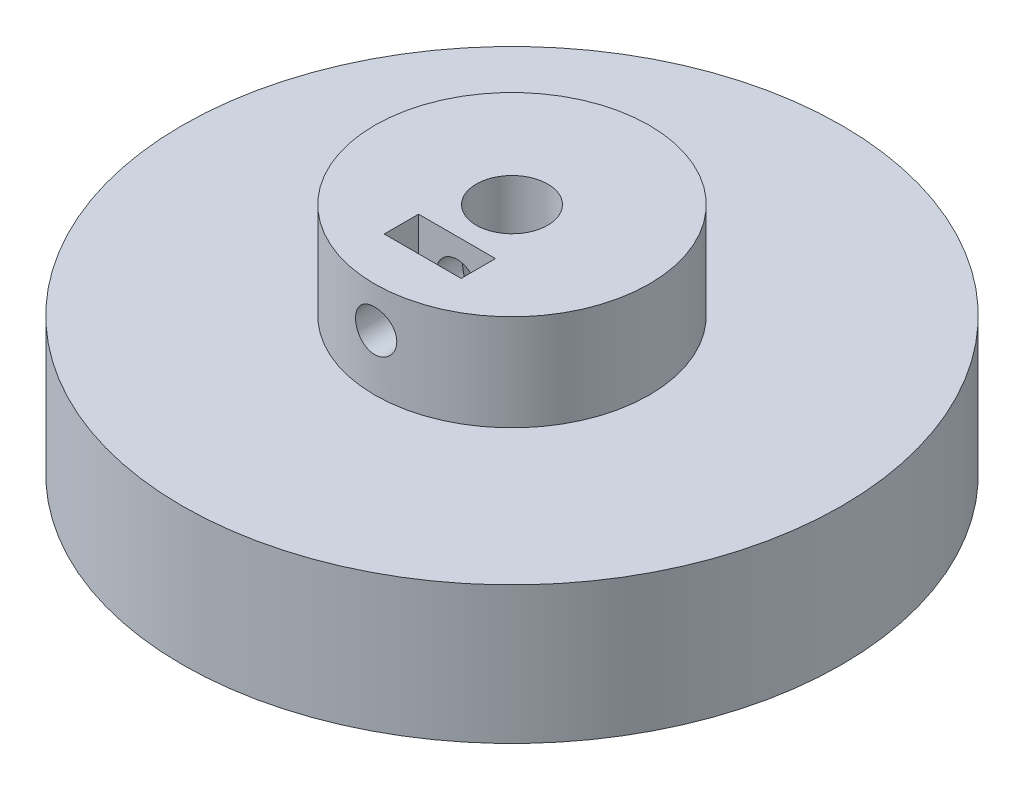
ISO-10303-21;
HEADER;
FILE_DESCRIPTION(('STEP AP214'),'2;1');
FILE_NAME('part.step','',(''),(''),'','','');
FILE_SCHEMA(('AUTOMOTIVE_DESIGN { 1 0 10303 214 1 1 1 1 }'));
ENDSEC;
DATA;
#1=APPLICATION_CONTEXT('core data for automotive mechanical design processes');
#2=APPLICATION_PROTOCOL_DEFINITION('international standard','automotive_design',2000,#1);
#3=PRODUCT_CONTEXT('',#1,'mechanical');
#4=PRODUCT('Part','Part','',(#3));
#5=PRODUCT_RELATED_PRODUCT_CATEGORY('part','',(#4));
#6=PRODUCT_DEFINITION_FORMATION('','',#4);
#7=PRODUCT_DEFINITION_CONTEXT('part definition',#1,'design');
#8=PRODUCT_DEFINITION('design','',#6,#7);
#9=PRODUCT_DEFINITION_SHAPE('','',#8);
#10=(LENGTH_UNIT() NAMED_UNIT(*) SI_UNIT(.MILLI.,.METRE.));
#11=(NAMED_UNIT(*) PLANE_ANGLE_UNIT() SI_UNIT($,.RADIAN.));
#12=(NAMED_UNIT(*) SI_UNIT($,.STERADIAN.) SOLID_ANGLE_UNIT());
#13=UNCERTAINTY_MEASURE_WITH_UNIT(LENGTH_MEASURE(1.E-05),#10,'distance_accuracy_value','');
#14=(GEOMETRIC_REPRESENTATION_CONTEXT(3) GLOBAL_UNCERTAINTY_ASSIGNED_CONTEXT((#13)) GLOBAL_UNIT_ASSIGNED_CONTEXT((#10,
#11,#12)) REPRESENTATION_CONTEXT('',''));
#15=CARTESIAN_POINT('',(0.,0.,0.));
#16=DIRECTION('',(0.,0.,1.));
#17=DIRECTION('',(1.,0.,0.));
#18=AXIS2_PLACEMENT_3D('',#15,#16,#17);
#19=CARTESIAN_POINT('',(0.,10.,0.));
#20=DIRECTION('',(0.,-1.,0.));
#21=DIRECTION('',(0.,0.,-1.));
#22=AXIS2_PLACEMENT_3D('',#19,#20,#21);
#23=CYLINDRICAL_SURFACE('',#22,2.6);
#24=CARTESIAN_POINT('',(0.,17.,0.));
#25=DIRECTION('',(0.,1.,0.));
#26=DIRECTION('',(0.,0.,1.));
#27=AXIS2_PLACEMENT_3D('',#24,#25,#26);
#28=CIRCLE('',#27,2.6);
#29=CARTESIAN_POINT('',(0.,17.,2.6));
#30=VERTEX_POINT('',#29);
#31=EDGE_CURVE('E113',#30,#30,#28,.T.);
#32=ORIENTED_EDGE('',*,*,#31,.T.);
#33=EDGE_LOOP('',(#32));
#34=FACE_BOUND('',#33,.T.);
#35=CARTESIAN_POINT('',(0.,0.,0.));
#36=DIRECTION('',(0.,1.,0.));
#37=DIRECTION('',(0.,0.,1.));
#38=AXIS2_PLACEMENT_3D('',#35,#36,#37);
#39=CIRCLE('',#38,2.6);
#40=CARTESIAN_POINT('',(0.,0.,2.6));
#41=VERTEX_POINT('',#40);
#42=EDGE_CURVE('E122',#41,#41,#39,.T.);
#43=ORIENTED_EDGE('',*,*,#42,.F.);
#44=EDGE_LOOP('',(#43));
#45=FACE_BOUND('',#44,.T.);
#46=CARTESIAN_POINT('',(-1.5,14.05,2.12367605815953));
#47=CARTESIAN_POINT('',(-1.49999928909873,13.973837770212,2.12367732010197));
#48=CARTESIAN_POINT('',(-1.49416319943128,13.8976702121097,2.12783497879457));
#49=CARTESIAN_POINT('',(-1.4712117447442,13.7478504529587,2.14376324889551));
#50=CARTESIAN_POINT('',(-1.45408458370784,13.6742009673258,2.15554182179209));
#51=CARTESIAN_POINT('',(-1.40963799696196,13.5318789448987,2.18486059394223));
#52=CARTESIAN_POINT('',(-1.38238602948755,13.4631769826637,2.20236256959965));
#53=CARTESIAN_POINT('',(-1.31867721679055,13.3313509400806,2.24108849396905));
#54=CARTESIAN_POINT('',(-1.28221740924734,13.268228663653,2.26231363981651));
#55=CARTESIAN_POINT('',(-1.19635715928324,13.141583753532,2.30897656645711));
#56=CARTESIAN_POINT('',(-1.14596421323542,13.0788095391015,2.33461985660883));
#57=CARTESIAN_POINT('',(-1.03570981206247,12.9619919633911,2.38558124715328));
#58=CARTESIAN_POINT('',(-0.975842071598218,12.9079544462636,2.4108991195318));
#59=CARTESIAN_POINT('',(-0.841259664027048,12.8049548798976,2.46128563521212));
#60=CARTESIAN_POINT('',(-0.765667222763018,12.7569980355903,2.4860904122246));
#61=CARTESIAN_POINT('',(-0.605784390319975,12.674833958949,2.52979639956002));
#62=CARTESIAN_POINT('',(-0.521501412024682,12.6406151282782,2.54870258675667));
#63=CARTESIAN_POINT('',(-0.354629136650123,12.5901580656908,2.57696402775433));
#64=CARTESIAN_POINT('',(-0.272566870909835,12.5725815912902,2.58702424897548));
#65=CARTESIAN_POINT('',(-0.106100690501685,12.5514125444315,2.59917001209048));
#66=CARTESIAN_POINT('',(-0.0216988270859573,12.5478080895792,2.60126233019818));
#67=CARTESIAN_POINT('',(0.13660793299446,12.5543783471323,2.59747641211859));
#68=CARTESIAN_POINT('',(0.210604602338939,12.563017339875,2.59248641573026));
#69=CARTESIAN_POINT('',(0.355883792545236,12.5909529761995,2.57656484138954));
#70=CARTESIAN_POINT('',(0.427166113020732,12.6102504050142,2.5656328256751));
#71=CARTESIAN_POINT('',(0.56585545770048,12.6588648188554,2.53867012485717));
#72=CARTESIAN_POINT('',(0.633225205378961,12.6882640218072,2.5225976787189));
#73=CARTESIAN_POINT('',(0.762182204899402,12.7560179655808,2.48667753467699));
#74=CARTESIAN_POINT('',(0.823767782190763,12.7943752886928,2.4668287485025));
#75=CARTESIAN_POINT('',(0.946948510867342,12.8839245001635,2.42240570497883));
#76=CARTESIAN_POINT('',(1.00773978147128,12.9360823734091,2.39755063533367));
#77=CARTESIAN_POINT('',(1.12020857346445,13.0492460636409,2.34711329727581));
#78=CARTESIAN_POINT('',(1.17187461209173,13.1102628549099,2.32153015901729));
#79=CARTESIAN_POINT('',(1.26995614846561,13.2468859370413,2.26949272251829));
#80=CARTESIAN_POINT('',(1.31528747522395,13.3233470082054,2.24321878996152));
#81=CARTESIAN_POINT('',(1.392159774247,13.4844728563789,2.19634530249607));
#82=CARTESIAN_POINT('',(1.42372543413371,13.5691226116061,2.17573561398002));
#83=CARTESIAN_POINT('',(1.46579572293508,13.7239627857703,2.14753990259684));
#84=CARTESIAN_POINT('',(1.47949087515376,13.7929385479801,2.13803987650995));
#85=CARTESIAN_POINT('',(1.49705901885595,13.9326943180771,2.12577891823736));
#86=CARTESIAN_POINT('',(1.5009417889033,14.0034724586714,2.12301127697307));
#87=CARTESIAN_POINT('',(1.49866933768971,14.1448296618716,2.12461548246257));
#88=CARTESIAN_POINT('',(1.49250682579391,14.2154085426112,2.12899251465939));
#89=CARTESIAN_POINT('',(1.47048994966506,14.3543255516771,2.14425567601924));
#90=CARTESIAN_POINT('',(1.45462840098487,14.4226619793583,2.15514663016219));
#91=CARTESIAN_POINT('',(1.41375551288671,14.5561863131854,2.18217669779433));
#92=CARTESIAN_POINT('',(1.38865282254981,14.6213351627332,2.19836802336967));
#93=CARTESIAN_POINT('',(1.33016448982582,14.7467470218488,2.2342420909138));
#94=CARTESIAN_POINT('',(1.29677551673343,14.8070080537831,2.25392623592669));
#95=CARTESIAN_POINT('',(1.21613405486751,14.9317168861868,2.29858249016957));
#96=CARTESIAN_POINT('',(1.16749199915642,14.9951495304527,2.3238859309454));
#97=CARTESIAN_POINT('',(1.06075616664744,15.1135590400097,2.37450848915311));
#98=CARTESIAN_POINT('',(1.00265431412986,15.1685286017615,2.39982760140228));
#99=CARTESIAN_POINT('',(0.871260123942492,15.2742292925709,2.45079018162418));
#100=CARTESIAN_POINT('',(0.797012462386164,15.3239045838234,2.47618705625137));
#101=CARTESIAN_POINT('',(0.639554312053565,15.4097764768482,2.52143997375939));
#102=CARTESIAN_POINT('',(0.556350815332729,15.4459834966424,2.54130029630008));
#103=CARTESIAN_POINT('',(0.39030996677297,15.5007492002042,2.57180865998144));
#104=CARTESIAN_POINT('',(0.307978336873566,15.5204903212052,2.58306774587589));
#105=CARTESIAN_POINT('',(0.140497477622674,15.5457985176372,2.5975566843405));
#106=CARTESIAN_POINT('',(0.0553509376532832,15.5513787474153,2.60079398844507));
#107=CARTESIAN_POINT('',(-0.10433868077498,15.5482379482811,2.59898472233435));
#108=CARTESIAN_POINT('',(-0.178931432297284,15.5411482610506,2.59488302030133));
#109=CARTESIAN_POINT('',(-0.325656870659688,15.5161124045963,2.58057740798517));
#110=CARTESIAN_POINT('',(-0.397789444478431,15.4981657373071,2.57037321774982));
#111=CARTESIAN_POINT('',(-0.537664248058522,15.4522599124164,2.54479309223234));
#112=CARTESIAN_POINT('',(-0.605412686943569,15.4243152981026,2.52942467094577));
#113=CARTESIAN_POINT('',(-0.7353320803717,15.3594140980348,2.49475720002296));
#114=CARTESIAN_POINT('',(-0.797501563406394,15.3224551441552,2.47545711773368));
#115=CARTESIAN_POINT('',(-0.921838925050048,15.2359855925234,2.43207944028664));
#116=CARTESIAN_POINT('',(-0.983255216767378,15.1855417890794,2.40770988244255));
#117=CARTESIAN_POINT('',(-1.09724560309867,15.0758273043888,2.35795023619029));
#118=CARTESIAN_POINT('',(-1.14980902693823,15.0165461309371,2.33255896126666));
#119=CARTESIAN_POINT('',(-1.25040932414557,14.8831835144438,2.28035609192218));
#120=CARTESIAN_POINT('',(-1.29732744722405,14.808193061989,2.25369157531941));
#121=CARTESIAN_POINT('',(-1.37769988814837,14.649830806884,2.20548197132038));
#122=CARTESIAN_POINT('',(-1.41117384140497,14.5664714513663,2.1839294367877));
#123=CARTESIAN_POINT('',(-1.45766619930362,14.4110794394401,2.153096589716));
#124=CARTESIAN_POINT('',(-1.4734629781497,14.3402002048169,2.14221044487334));
#125=CARTESIAN_POINT('',(-1.49462441162833,14.1962139013276,2.12750350692466));
#126=CARTESIAN_POINT('',(-1.50000068240608,14.1231094055256,2.12367484679975));
#127=CARTESIAN_POINT('',(-1.5,14.05,2.12367605815953));
#128=B_SPLINE_CURVE_WITH_KNOTS('',3,(#46,#47,#48,#49,#50,#51,#52,#53,#54,#55,#56,#57,#58,#59,
#60,#61,#62,#63,#64,#65,#66,#67,#68,#69,#70,#71,#72,#73,#74,#75,#76,#77,#78,#79,#80,#81,#82,#83,
#84,#85,#86,#87,#88,#89,#90,#91,#92,#93,#94,#95,#96,#97,#98,#99,#100,#101,#102,#103,#104,#105,
#106,#107,#108,#109,#110,#111,#112,#113,#114,#115,#116,#117,#118,#119,#120,#121,#122,#123,#124,
#125,#126,#127),.UNSPECIFIED.,.T.,.F.,(4,2,2,2,2,2,2,2,2,2,2,2,2,2,2,2,2,2,2,2,2,2,2,2,2,2,2,2,
2,2,2,2,2,2,2,2,2,2,2,2,4),(0.,0.22818073696537,0.456600237661381,0.683524377783629,
0.910521616515776,1.16296654818033,1.41557965285597,1.69276833548025,1.96972250657426,
2.221817266928,2.47369758818007,2.69663531639211,2.91958947115938,3.14440299623232,
3.3692814067782,3.61986966773501,3.87077104472552,4.14744005240321,4.42361081512825,
4.63556517681602,4.84730823119932,5.05920503226263,5.27125898384192,5.48546803686254,
5.69976333194176,5.95029577620478,6.20104322949431,6.47819476053164,6.75513146037915,
7.00985957501131,7.26435098062857,7.48839085392635,7.71244100586237,7.93616656459879,
8.15995096092182,8.40833788917721,8.65702209974311,8.93282611425964,9.20822583513674,
9.42750494270329,9.64653947042618),.UNSPECIFIED.);
#129=CARTESIAN_POINT('',(-1.5,14.05,2.12367605815953));
#130=VERTEX_POINT('',#129);
#131=EDGE_CURVE('E107',#130,#130,#128,.T.);
#132=ORIENTED_EDGE('',*,*,#131,.T.);
#133=EDGE_LOOP('',(#132));
#134=FACE_BOUND('',#133,.T.);
#135=ADVANCED_FACE('F33',(#34,#45,#134),#23,.F.);
#136=CARTESIAN_POINT('',(0.,17.,0.));
#137=DIRECTION('',(0.,-1.,0.));
#138=DIRECTION('',(0.,0.,-1.));
#139=AXIS2_PLACEMENT_3D('',#136,#137,#138);
#140=CYLINDRICAL_SURFACE('',#139,10.);
#141=CARTESIAN_POINT('',(0.,17.,0.));
#142=DIRECTION('',(0.,1.,0.));
#143=DIRECTION('',(0.,0.,1.));
#144=AXIS2_PLACEMENT_3D('',#141,#142,#143);
#145=CIRCLE('',#144,10.);
#146=CARTESIAN_POINT('',(0.,17.,10.));
#147=VERTEX_POINT('',#146);
#148=EDGE_CURVE('E119',#147,#147,#145,.T.);
#149=ORIENTED_EDGE('',*,*,#148,.F.);
#150=EDGE_LOOP('',(#149));
#151=FACE_BOUND('',#150,.T.);
#152=CARTESIAN_POINT('',(0.,10.,0.));
#153=DIRECTION('',(0.,1.,0.));
#154=DIRECTION('',(0.,0.,1.));
#155=AXIS2_PLACEMENT_3D('',#152,#153,#154);
#156=CIRCLE('',#155,10.);
#157=CARTESIAN_POINT('',(0.,10.,10.));
#158=VERTEX_POINT('',#157);
#159=EDGE_CURVE('E118',#158,#158,#156,.T.);
#160=ORIENTED_EDGE('',*,*,#159,.T.);
#161=EDGE_LOOP('',(#160));
#162=FACE_BOUND('',#161,.T.);
#163=CARTESIAN_POINT('',(-1.5,14.05,9.88685996664259));
#164=CARTESIAN_POINT('',(-1.49999654107284,13.96625443071,9.88686136668593));
#165=CARTESIAN_POINT('',(-1.49296296388491,13.8824602492493,9.88793551739101));
#166=CARTESIAN_POINT('',(-1.46502196657001,13.7172146851169,9.8921131480324));
#167=CARTESIAN_POINT('',(-1.44410101402628,13.63576566852,9.8952186073143));
#168=CARTESIAN_POINT('',(-1.38902526098084,13.4776262445531,9.90309938986228));
#169=CARTESIAN_POINT('',(-1.35488061681397,13.4009322374578,9.90787343131536));
#170=CARTESIAN_POINT('',(-1.27435063087791,13.2543729692279,9.91855194113145));
#171=CARTESIAN_POINT('',(-1.22796697429872,13.1845067697857,9.92445625383668));
#172=CARTESIAN_POINT('',(-1.12387902418558,13.0530161832457,9.9367828924804));
#173=CARTESIAN_POINT('',(-1.0660960558482,12.9914543865933,9.94320862458057));
#174=CARTESIAN_POINT('',(-0.941019605444374,12.8788625143445,9.95582368169047));
#175=CARTESIAN_POINT('',(-0.873725600786529,12.827833017833,9.96201299368615));
#176=CARTESIAN_POINT('',(-0.731136358052745,12.7375233683086,9.97349347428185));
#177=CARTESIAN_POINT('',(-0.655804227365767,12.6983008496775,9.97878018435569));
#178=CARTESIAN_POINT('',(-0.499528850106974,12.6330884011918,9.98782206746405));
#179=CARTESIAN_POINT('',(-0.418585900270677,12.6070977721571,9.99157732141945));
#180=CARTESIAN_POINT('',(-0.254031123090569,12.5692766114692,9.99710914797782));
#181=CARTESIAN_POINT('',(-0.170443884389866,12.5573412736128,9.99890035887344));
#182=CARTESIAN_POINT('',(-0.00243520401947892,12.5476440651751,10.0003524476958));
#183=CARTESIAN_POINT('',(0.0819861910157465,12.5498814066803,10.0000134440494));
#184=CARTESIAN_POINT('',(0.24855171820052,12.5683833377624,9.99725499660796));
#185=CARTESIAN_POINT('',(0.330708691400008,12.5845351717915,9.99485227652479));
#186=CARTESIAN_POINT('',(0.491132829143137,12.6302306063226,9.98825500227851));
#187=CARTESIAN_POINT('',(0.569399893513481,12.6597745515014,9.98406040199739));
#188=CARTESIAN_POINT('',(0.720163780770317,12.7315309969171,9.97432193873206));
#189=CARTESIAN_POINT('',(0.792637672323596,12.7737909651087,9.96877303515638));
#190=CARTESIAN_POINT('',(0.929507907150177,12.86974519367,9.95694438245421));
#191=CARTESIAN_POINT('',(0.993903718271735,12.9234402067069,9.95066458523184));
#192=CARTESIAN_POINT('',(1.11345448272265,13.0413684488266,9.93800158192627));
#193=CARTESIAN_POINT('',(1.16851232950947,13.1057001219701,9.93161796623257));
#194=CARTESIAN_POINT('',(1.26706599338813,13.2427410771237,9.91952704453523));
#195=CARTESIAN_POINT('',(1.31056173927999,13.3154504107199,9.91381974269649));
#196=CARTESIAN_POINT('',(1.38476964534605,13.4672839629406,9.90372775286855));
#197=CARTESIAN_POINT('',(1.41547182270082,13.5464131336624,9.89934409845291));
#198=CARTESIAN_POINT('',(1.46312336208879,13.7087852551474,9.89241402899059));
#199=CARTESIAN_POINT('',(1.48007369337326,13.7920279155468,9.88986748446299));
#200=CARTESIAN_POINT('',(1.49960720086655,13.9594000895775,9.88692451395027));
#201=CARTESIAN_POINT('',(1.50232803265052,14.0435131882015,9.88650748802574));
#202=CARTESIAN_POINT('',(1.49369057019819,14.2109941948173,9.88781607937153));
#203=CARTESIAN_POINT('',(1.48233271282302,14.2943621258508,9.88954163015778));
#204=CARTESIAN_POINT('',(1.44597702952766,14.4575598179656,9.89492202461453));
#205=CARTESIAN_POINT('',(1.42104778527821,14.5374052049416,9.89856716482858));
#206=CARTESIAN_POINT('',(1.35832831947087,14.6917840920486,9.90736801825768));
#207=CARTESIAN_POINT('',(1.32053746276389,14.7663173296282,9.91252380607176));
#208=CARTESIAN_POINT('',(1.23283677995323,14.908573260335,9.92381355687063));
#209=CARTESIAN_POINT('',(1.18283784561766,14.9762404472798,9.92995459279988));
#210=CARTESIAN_POINT('',(1.07226416837201,15.1022728598738,9.94250159433355));
#211=CARTESIAN_POINT('',(1.01168882744679,15.1606375591812,9.94890757490292));
#212=CARTESIAN_POINT('',(0.881075619628182,15.2669026066336,9.96132705217386));
#213=CARTESIAN_POINT('',(0.810963126771956,15.3147117282425,9.96733683460423));
#214=CARTESIAN_POINT('',(0.66362208026368,15.3978729052626,9.97822905032016));
#215=CARTESIAN_POINT('',(0.586393721360438,15.433225301465,9.98311151444563));
#216=CARTESIAN_POINT('',(0.427297995861146,15.490323742488,9.99118269660795));
#217=CARTESIAN_POINT('',(0.345448858754302,15.5121196670784,9.99437761717899));
#218=CARTESIAN_POINT('',(0.179200815501192,15.5416478795375,9.99873976656896));
#219=CARTESIAN_POINT('',(0.0948020781305799,15.5493810962491,9.99990712930801));
#220=CARTESIAN_POINT('',(-0.0732645908608196,15.5505417045494,10.0000812905914));
#221=CARTESIAN_POINT('',(-0.156931570212053,15.544108680877,9.99910917023796));
#222=CARTESIAN_POINT('',(-0.321979795323108,15.5174186115792,9.99515610519141));
#223=CARTESIAN_POINT('',(-0.403361048396513,15.4971616101914,9.99217516692666));
#224=CARTESIAN_POINT('',(-0.561489374379661,15.4434481244298,9.98453786742463));
#225=CARTESIAN_POINT('',(-0.638239793148783,15.4100013048611,9.97988273316947));
#226=CARTESIAN_POINT('',(-0.785061117896603,15.3308725120169,9.96940834495499));
#227=CARTESIAN_POINT('',(-0.855131806920709,15.2851901415197,9.96358905320338));
#228=CARTESIAN_POINT('',(-0.987312585191959,15.1823823011708,9.95136510636178));
#229=CARTESIAN_POINT('',(-1.04934206644638,15.1251537741837,9.94495548425942));
#230=CARTESIAN_POINT('',(-1.16296808390268,15.0010949269195,9.93231001689001));
#231=CARTESIAN_POINT('',(-1.21456216798984,14.9342623561757,9.92607421276291));
#232=CARTESIAN_POINT('',(-1.30611310822974,14.7924510167675,9.91444484029116));
#233=CARTESIAN_POINT('',(-1.34600294291209,14.7174285829782,9.90905620156985));
#234=CARTESIAN_POINT('',(-1.41255613872045,14.5617032232367,9.89978909110724));
#235=CARTESIAN_POINT('',(-1.43923322574897,14.4810062921422,9.89590905307931));
#236=CARTESIAN_POINT('',(-1.47254951890026,14.3416225637435,9.89099485524825));
#237=CARTESIAN_POINT('',(-1.4828276978042,14.2837966030757,9.88945249382379));
#238=CARTESIAN_POINT('',(-1.49655410576574,14.1673217082656,9.88738456567011));
#239=CARTESIAN_POINT('',(-1.50000242335076,14.1086727848004,9.88685898576155));
#240=CARTESIAN_POINT('',(-1.5,14.05,9.88685996664259));
#241=B_SPLINE_CURVE_WITH_KNOTS('',3,(#163,#164,#165,#166,#167,#168,#169,#170,#171,#172,#173,
#174,#175,#176,#177,#178,#179,#180,#181,#182,#183,#184,#185,#186,#187,#188,#189,#190,#191,#192,
#193,#194,#195,#196,#197,#198,#199,#200,#201,#202,#203,#204,#205,#206,#207,#208,#209,#210,#211,
#212,#213,#214,#215,#216,#217,#218,#219,#220,#221,#222,#223,#224,#225,#226,#227,#228,#229,#230,
#231,#232,#233,#234,#235,#236,#237,#238,#239,#240),.UNSPECIFIED.,.T.,.F.,(4,2,2,2,2,2,2,2,2,2,2,
2,2,2,2,2,2,2,2,2,2,2,2,2,2,2,2,2,2,2,2,2,2,2,2,2,2,2,4),(0.,0.251022251804867,
0.502289469561802,0.753364085335674,1.00440414866132,1.25724158649107,1.51009292207817,
1.76415922105782,2.01821209364501,2.27035832534397,2.52249053939374,2.77259862515728,
3.02271314839401,3.27377316386453,3.52484970949272,3.77839544666269,4.0319427451435,
4.28568751773139,4.53941440444341,4.79068214603744,5.04194209099918,5.29194394807374,
5.54195815286117,5.79385486001302,6.04576581461802,6.29977537753516,6.55377799071854,
6.8068404089109,7.05988611170473,7.31044963622326,7.56101235892823,7.81139182257833,
8.06177941567106,8.31450950010969,8.56729890236862,8.82150878824931,9.07545403445563,
9.25132441891613,9.42719252376192),.UNSPECIFIED.);
#242=CARTESIAN_POINT('',(-1.5,14.05,9.88685996664259));
#243=VERTEX_POINT('',#242);
#244=EDGE_CURVE('E144',#243,#243,#241,.T.);
#245=ORIENTED_EDGE('',*,*,#244,.F.);
#246=EDGE_LOOP('',(#245));
#247=FACE_BOUND('',#246,.T.);
#248=ADVANCED_FACE('F138',(#151,#162,#247),#140,.T.);
#249=CARTESIAN_POINT('',(0.,10.,0.));
#250=DIRECTION('',(0.,1.,0.));
#251=DIRECTION('',(0.,0.,1.));
#252=AXIS2_PLACEMENT_3D('',#249,#250,#251);
#253=PLANE('',#252);
#254=CARTESIAN_POINT('',(0.,10.,0.));
#255=DIRECTION('',(0.,1.,0.));
#256=DIRECTION('',(0.,0.,1.));
#257=AXIS2_PLACEMENT_3D('',#254,#255,#256);
#258=CIRCLE('',#257,24.);
#259=CARTESIAN_POINT('',(0.,10.,24.));
#260=VERTEX_POINT('',#259);
#261=EDGE_CURVE('E11',#260,#260,#258,.T.);
#262=ORIENTED_EDGE('',*,*,#261,.T.);
#263=EDGE_LOOP('',(#262));
#264=FACE_BOUND('',#263,.T.);
#265=ORIENTED_EDGE('',*,*,#159,.F.);
#266=EDGE_LOOP('',(#265));
#267=FACE_BOUND('',#266,.T.);
#268=ADVANCED_FACE('F133',(#264,#267),#253,.T.);
#269=CARTESIAN_POINT('',(0.,0.,0.));
#270=DIRECTION('',(0.,1.,0.));
#271=DIRECTION('',(0.,0.,1.));
#272=AXIS2_PLACEMENT_3D('',#269,#270,#271);
#273=PLANE('',#272);
#274=CARTESIAN_POINT('',(0.,0.,0.));
#275=DIRECTION('',(0.,1.,0.));
#276=DIRECTION('',(0.,0.,1.));
#277=AXIS2_PLACEMENT_3D('',#274,#275,#276);
#278=CIRCLE('',#277,24.);
#279=CARTESIAN_POINT('',(0.,0.,24.));
#280=VERTEX_POINT('',#279);
#281=EDGE_CURVE('E42',#280,#280,#278,.T.);
#282=ORIENTED_EDGE('',*,*,#281,.F.);
#283=EDGE_LOOP('',(#282));
#284=FACE_BOUND('',#283,.T.);
#285=ORIENTED_EDGE('',*,*,#42,.T.);
#286=EDGE_LOOP('',(#285));
#287=FACE_BOUND('',#286,.T.);
#288=ADVANCED_FACE('F130',(#284,#287),#273,.F.);
#289=CARTESIAN_POINT('',(0.,10.,0.));
#290=DIRECTION('',(0.,-1.,0.));
#291=DIRECTION('',(0.,0.,-1.));
#292=AXIS2_PLACEMENT_3D('',#289,#290,#291);
#293=CYLINDRICAL_SURFACE('',#292,24.);
#294=ORIENTED_EDGE('',*,*,#261,.F.);
#295=EDGE_LOOP('',(#294));
#296=FACE_BOUND('',#295,.T.);
#297=ORIENTED_EDGE('',*,*,#281,.T.);
#298=EDGE_LOOP('',(#297));
#299=FACE_BOUND('',#298,.T.);
#300=ADVANCED_FACE('F35',(#296,#299),#293,.T.);
#301=CARTESIAN_POINT('',(0.,17.,0.));
#302=DIRECTION('',(0.,1.,0.));
#303=DIRECTION('',(0.,0.,1.));
#304=AXIS2_PLACEMENT_3D('',#301,#302,#303);
#305=PLANE('',#304);
#306=DIRECTION('',(0.,0.,1.));
#307=VECTOR('',#306,1.);
#308=CARTESIAN_POINT('',(-2.8,17.,4.));
#309=LINE('',#308,#307);
#310=CARTESIAN_POINT('',(-2.8,17.,4.));
#311=VERTEX_POINT('',#310);
#312=CARTESIAN_POINT('',(-2.8,17.,6.5));
#313=VERTEX_POINT('',#312);
#314=EDGE_CURVE('E50',#311,#313,#309,.T.);
#315=ORIENTED_EDGE('',*,*,#314,.F.);
#316=DIRECTION('',(-1.,0.,0.));
#317=VECTOR('',#316,1.);
#318=CARTESIAN_POINT('',(-2.8,17.,4.));
#319=LINE('',#318,#317);
#320=CARTESIAN_POINT('',(2.8,17.,4.));
#321=VERTEX_POINT('',#320);
#322=EDGE_CURVE('E101',#321,#311,#319,.T.);
#323=ORIENTED_EDGE('',*,*,#322,.F.);
#324=DIRECTION('',(0.,0.,-1.));
#325=VECTOR('',#324,1.);
#326=CARTESIAN_POINT('',(2.8,17.,4.));
#327=LINE('',#326,#325);
#328=CARTESIAN_POINT('',(2.8,17.,6.5));
#329=VERTEX_POINT('',#328);
#330=EDGE_CURVE('E109',#329,#321,#327,.T.);
#331=ORIENTED_EDGE('',*,*,#330,.F.);
#332=DIRECTION('',(1.,0.,0.));
#333=VECTOR('',#332,1.);
#334=CARTESIAN_POINT('',(-2.8,17.,6.5));
#335=LINE('',#334,#333);
#336=EDGE_CURVE('E85',#313,#329,#335,.T.);
#337=ORIENTED_EDGE('',*,*,#336,.F.);
#338=EDGE_LOOP('',(#315,#323,#331,#337));
#339=FACE_BOUND('',#338,.T.);
#340=ORIENTED_EDGE('',*,*,#148,.T.);
#341=EDGE_LOOP('',(#340));
#342=FACE_BOUND('',#341,.T.);
#343=ORIENTED_EDGE('',*,*,#31,.F.);
#344=EDGE_LOOP('',(#343));
#345=FACE_BOUND('',#344,.T.);
#346=ADVANCED_FACE('F180',(#339,#342,#345),#305,.T.);
#347=CARTESIAN_POINT('',(-2.8,11.4,4.));
#348=DIRECTION('',(-1.,0.,0.));
#349=DIRECTION('',(0.,0.,1.));
#350=AXIS2_PLACEMENT_3D('',#347,#348,#349);
#351=PLANE('',#350);
#352=ORIENTED_EDGE('',*,*,#314,.T.);
#353=DIRECTION('',(0.,1.,0.));
#354=VECTOR('',#353,1.);
#355=CARTESIAN_POINT('',(-2.8,11.4,6.5));
#356=LINE('',#355,#354);
#357=CARTESIAN_POINT('',(-2.8,11.4,6.5));
#358=VERTEX_POINT('',#357);
#359=EDGE_CURVE('E73',#358,#313,#356,.T.);
#360=ORIENTED_EDGE('',*,*,#359,.F.);
#361=DIRECTION('',(0.,0.,1.));
#362=VECTOR('',#361,1.);
#363=CARTESIAN_POINT('',(-2.8,11.4,4.));
#364=LINE('',#363,#362);
#365=CARTESIAN_POINT('',(-2.8,11.4,4.));
#366=VERTEX_POINT('',#365);
#367=EDGE_CURVE('E99',#366,#358,#364,.T.);
#368=ORIENTED_EDGE('',*,*,#367,.F.);
#369=DIRECTION('',(0.,1.,0.));
#370=VECTOR('',#369,1.);
#371=CARTESIAN_POINT('',(-2.8,11.4,4.));
#372=LINE('',#371,#370);
#373=EDGE_CURVE('E58',#366,#311,#372,.T.);
#374=ORIENTED_EDGE('',*,*,#373,.T.);
#375=EDGE_LOOP('',(#352,#360,#368,#374));
#376=FACE_BOUND('',#375,.T.);
#377=ADVANCED_FACE('F171',(#376),#351,.F.);
#378=CARTESIAN_POINT('',(-2.8,11.4,4.));
#379=DIRECTION('',(0.,0.,-1.));
#380=DIRECTION('',(-1.,0.,0.));
#381=AXIS2_PLACEMENT_3D('',#378,#379,#380);
#382=PLANE('',#381);
#383=CARTESIAN_POINT('',(0.,14.05,4.));
#384=DIRECTION('',(0.,0.,-1.));
#385=DIRECTION('',(-1.,0.,0.));
#386=AXIS2_PLACEMENT_3D('',#383,#384,#385);
#387=CIRCLE('',#386,1.5);
#388=CARTESIAN_POINT('',(-1.5,14.05,4.));
#389=VERTEX_POINT('',#388);
#390=EDGE_CURVE('E146',#389,#389,#387,.F.);
#391=ORIENTED_EDGE('',*,*,#390,.F.);
#392=EDGE_LOOP('',(#391));
#393=FACE_BOUND('',#392,.T.);
#394=ORIENTED_EDGE('',*,*,#322,.T.);
#395=ORIENTED_EDGE('',*,*,#373,.F.);
#396=DIRECTION('',(-1.,0.,0.));
#397=VECTOR('',#396,1.);
#398=CARTESIAN_POINT('',(-2.8,11.4,4.));
#399=LINE('',#398,#397);
#400=CARTESIAN_POINT('',(2.8,11.4,4.));
#401=VERTEX_POINT('',#400);
#402=EDGE_CURVE('E96',#401,#366,#399,.T.);
#403=ORIENTED_EDGE('',*,*,#402,.F.);
#404=DIRECTION('',(0.,1.,0.));
#405=VECTOR('',#404,1.);
#406=CARTESIAN_POINT('',(2.8,11.4,4.));
#407=LINE('',#406,#405);
#408=EDGE_CURVE('E89',#401,#321,#407,.T.);
#409=ORIENTED_EDGE('',*,*,#408,.T.);
#410=EDGE_LOOP('',(#394,#395,#403,#409));
#411=FACE_BOUND('',#410,.T.);
#412=ADVANCED_FACE('F168',(#393,#411),#382,.F.);
#413=CARTESIAN_POINT('',(2.8,11.4,4.));
#414=DIRECTION('',(1.,0.,0.));
#415=DIRECTION('',(0.,0.,-1.));
#416=AXIS2_PLACEMENT_3D('',#413,#414,#415);
#417=PLANE('',#416);
#418=ORIENTED_EDGE('',*,*,#330,.T.);
#419=ORIENTED_EDGE('',*,*,#408,.F.);
#420=DIRECTION('',(0.,0.,-1.));
#421=VECTOR('',#420,1.);
#422=CARTESIAN_POINT('',(2.8,11.4,4.));
#423=LINE('',#422,#421);
#424=CARTESIAN_POINT('',(2.8,11.4,6.5));
#425=VERTEX_POINT('',#424);
#426=EDGE_CURVE('E92',#425,#401,#423,.T.);
#427=ORIENTED_EDGE('',*,*,#426,.F.);
#428=DIRECTION('',(0.,1.,0.));
#429=VECTOR('',#428,1.);
#430=CARTESIAN_POINT('',(2.8,11.4,6.5));
#431=LINE('',#430,#429);
#432=EDGE_CURVE('E78',#425,#329,#431,.T.);
#433=ORIENTED_EDGE('',*,*,#432,.T.);
#434=EDGE_LOOP('',(#418,#419,#427,#433));
#435=FACE_BOUND('',#434,.T.);
#436=ADVANCED_FACE('F93',(#435),#417,.F.);
#437=CARTESIAN_POINT('',(-2.8,11.4,6.5));
#438=DIRECTION('',(0.,0.,1.));
#439=DIRECTION('',(1.,0.,0.));
#440=AXIS2_PLACEMENT_3D('',#437,#438,#439);
#441=PLANE('',#440);
#442=CARTESIAN_POINT('',(0.,14.05,6.5));
#443=DIRECTION('',(0.,0.,1.));
#444=DIRECTION('',(1.,0.,0.));
#445=AXIS2_PLACEMENT_3D('',#442,#443,#444);
#446=CIRCLE('',#445,1.5);
#447=CARTESIAN_POINT('',(1.5,14.05,6.5));
#448=VERTEX_POINT('',#447);
#449=EDGE_CURVE('E37',#448,#448,#446,.F.);
#450=ORIENTED_EDGE('',*,*,#449,.F.);
#451=EDGE_LOOP('',(#450));
#452=FACE_BOUND('',#451,.T.);
#453=ORIENTED_EDGE('',*,*,#336,.T.);
#454=ORIENTED_EDGE('',*,*,#432,.F.);
#455=DIRECTION('',(1.,0.,0.));
#456=VECTOR('',#455,1.);
#457=CARTESIAN_POINT('',(-2.8,11.4,6.5));
#458=LINE('',#457,#456);
#459=EDGE_CURVE('E82',#358,#425,#458,.T.);
#460=ORIENTED_EDGE('',*,*,#459,.F.);
#461=ORIENTED_EDGE('',*,*,#359,.T.);
#462=EDGE_LOOP('',(#453,#454,#460,#461));
#463=FACE_BOUND('',#462,.T.);
#464=ADVANCED_FACE('F80',(#452,#463),#441,.F.);
#465=CARTESIAN_POINT('',(0.,11.4,0.));
#466=DIRECTION('',(0.,1.,0.));
#467=DIRECTION('',(0.,0.,1.));
#468=AXIS2_PLACEMENT_3D('',#465,#466,#467);
#469=PLANE('',#468);
#470=ORIENTED_EDGE('',*,*,#367,.T.);
#471=ORIENTED_EDGE('',*,*,#459,.T.);
#472=ORIENTED_EDGE('',*,*,#426,.T.);
#473=ORIENTED_EDGE('',*,*,#402,.T.);
#474=EDGE_LOOP('',(#470,#471,#472,#473));
#475=FACE_BOUND('',#474,.T.);
#476=ADVANCED_FACE('F98',(#475),#469,.T.);
#477=CARTESIAN_POINT('',(0.,14.05,24.));
#478=DIRECTION('',(0.,0.,-1.));
#479=DIRECTION('',(-1.,0.,0.));
#480=AXIS2_PLACEMENT_3D('',#477,#478,#479);
#481=CYLINDRICAL_SURFACE('',#480,1.5);
#482=ORIENTED_EDGE('',*,*,#449,.T.);
#483=EDGE_LOOP('',(#482));
#484=FACE_BOUND('',#483,.T.);
#485=ORIENTED_EDGE('',*,*,#244,.T.);
#486=EDGE_LOOP('',(#485));
#487=FACE_BOUND('',#486,.T.);
#488=ADVANCED_FACE('F159',(#484,#487),#481,.F.);
#489=ORIENTED_EDGE('',*,*,#131,.F.);
#490=EDGE_LOOP('',(#489));
#491=FACE_BOUND('',#490,.T.);
#492=ORIENTED_EDGE('',*,*,#390,.T.);
#493=EDGE_LOOP('',(#492));
#494=FACE_BOUND('',#493,.T.);
#495=ADVANCED_FACE('F163',(#491,#494),#481,.F.);
#496=CLOSED_SHELL('',(#135,#248,#268,#288,#300,#346,#377,#412,#436,#464,#476,#488,#495));
#497=MANIFOLD_SOLID_BREP('B2',#496);
#498=ADVANCED_BREP_SHAPE_REPRESENTATION('',(#18,#497),#14);
#499=SHAPE_DEFINITION_REPRESENTATION(#9,#498);
ENDSEC;
END-ISO-10303-21;
